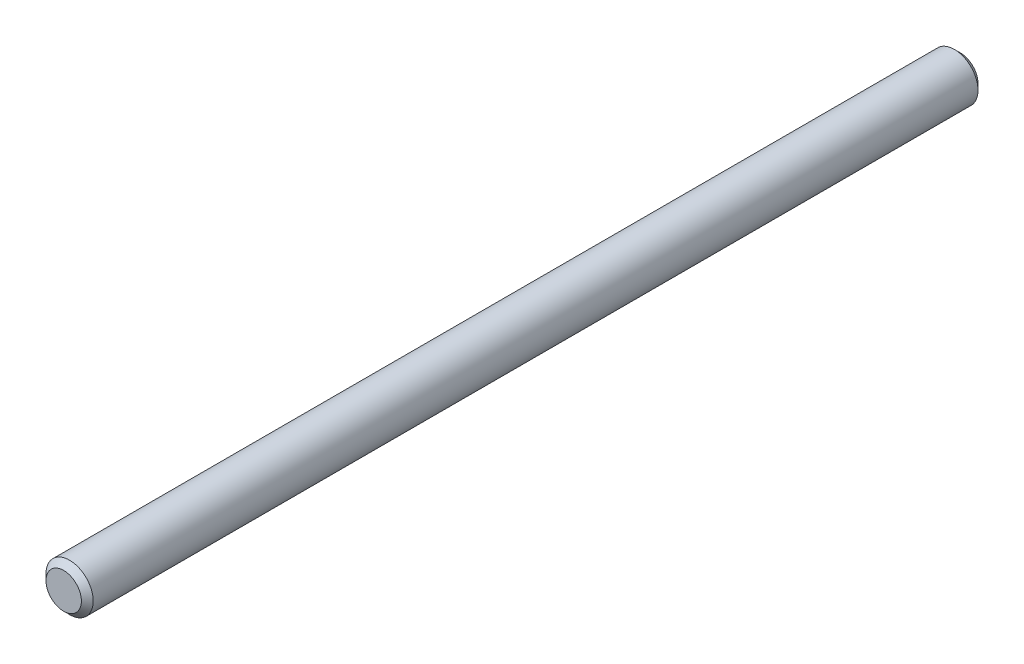
ISO-10303-21;
HEADER;
FILE_DESCRIPTION(('STEP AP214'),'2;1');
FILE_NAME('part.step','',(''),(''),'','','');
FILE_SCHEMA(('AUTOMOTIVE_DESIGN { 1 0 10303 214 1 1 1 1 }'));
ENDSEC;
DATA;
#1=APPLICATION_CONTEXT('core data for automotive mechanical design processes');
#2=APPLICATION_PROTOCOL_DEFINITION('international standard','automotive_design',2000,#1);
#3=PRODUCT_CONTEXT('',#1,'mechanical');
#4=PRODUCT('Part','Part','',(#3));
#5=PRODUCT_RELATED_PRODUCT_CATEGORY('part','',(#4));
#6=PRODUCT_DEFINITION_FORMATION('','',#4);
#7=PRODUCT_DEFINITION_CONTEXT('part definition',#1,'design');
#8=PRODUCT_DEFINITION('design','',#6,#7);
#9=PRODUCT_DEFINITION_SHAPE('','',#8);
#10=(LENGTH_UNIT() NAMED_UNIT(*) SI_UNIT(.MILLI.,.METRE.));
#11=(NAMED_UNIT(*) PLANE_ANGLE_UNIT() SI_UNIT($,.RADIAN.));
#12=(NAMED_UNIT(*) SI_UNIT($,.STERADIAN.) SOLID_ANGLE_UNIT());
#13=UNCERTAINTY_MEASURE_WITH_UNIT(LENGTH_MEASURE(1.E-05),#10,'distance_accuracy_value','');
#14=(GEOMETRIC_REPRESENTATION_CONTEXT(3) GLOBAL_UNCERTAINTY_ASSIGNED_CONTEXT((#13)) GLOBAL_UNIT_ASSIGNED_CONTEXT((#10,
#11,#12)) REPRESENTATION_CONTEXT('',''));
#15=CARTESIAN_POINT('',(0.,0.,0.));
#16=DIRECTION('',(0.,0.,1.));
#17=DIRECTION('',(1.,0.,0.));
#18=AXIS2_PLACEMENT_3D('',#15,#16,#17);
#19=CARTESIAN_POINT('',(0.,0.,114.));
#20=DIRECTION('',(0.,0.,-1.));
#21=DIRECTION('',(-1.,0.,0.));
#22=AXIS2_PLACEMENT_3D('',#19,#20,#21);
#23=CYLINDRICAL_SURFACE('',#22,3.);
#24=CARTESIAN_POINT('',(0.,0.,113.25));
#25=DIRECTION('',(0.,0.,1.));
#26=DIRECTION('',(1.,0.,0.));
#27=AXIS2_PLACEMENT_3D('',#24,#25,#26);
#28=CIRCLE('',#27,3.);
#29=CARTESIAN_POINT('',(-3.,0.,113.25));
#30=VERTEX_POINT('',#29);
#31=EDGE_CURVE('E10',#30,#30,#28,.F.);
#32=CARTESIAN_POINT('',(0.,0.,0.750000000000112));
#33=DIRECTION('',(0.,0.,1.));
#34=DIRECTION('',(1.,0.,0.));
#35=AXIS2_PLACEMENT_3D('',#32,#33,#34);
#36=CIRCLE('',#35,3.);
#37=CARTESIAN_POINT('',(-3.,0.,0.750000000000112));
#38=VERTEX_POINT('',#37);
#39=EDGE_CURVE('E46',#38,#38,#36,.T.);
#40=CARTESIAN_POINT('',(-3.,0.,113.25));
#41=CARTESIAN_POINT('',(-3.,0.,112.078125));
#42=CARTESIAN_POINT('',(-3.,0.,110.90625));
#43=CARTESIAN_POINT('',(-3.,0.,108.5625));
#44=CARTESIAN_POINT('',(-3.,0.,107.390625));
#45=CARTESIAN_POINT('',(-3.,0.,105.046875));
#46=CARTESIAN_POINT('',(-3.,0.,103.875));
#47=CARTESIAN_POINT('',(-3.,0.,101.53125));
#48=CARTESIAN_POINT('',(-3.,0.,100.359375));
#49=CARTESIAN_POINT('',(-3.,0.,98.0156250000001));
#50=CARTESIAN_POINT('',(-3.,0.,96.8437500000001));
#51=CARTESIAN_POINT('',(-3.,0.,94.5000000000001));
#52=CARTESIAN_POINT('',(-3.,0.,93.3281250000001));
#53=CARTESIAN_POINT('',(-3.,0.,90.9843750000001));
#54=CARTESIAN_POINT('',(-3.,0.,89.8125000000001));
#55=CARTESIAN_POINT('',(-3.,0.,87.4687500000001));
#56=CARTESIAN_POINT('',(-3.,0.,86.2968750000001));
#57=CARTESIAN_POINT('',(-3.,0.,83.9531250000001));
#58=CARTESIAN_POINT('',(-3.,0.,82.7812500000001));
#59=CARTESIAN_POINT('',(-3.,0.,80.4375000000001));
#60=CARTESIAN_POINT('',(-3.,0.,79.2656250000001));
#61=CARTESIAN_POINT('',(-3.,0.,76.9218750000001));
#62=CARTESIAN_POINT('',(-3.,0.,75.7500000000001));
#63=CARTESIAN_POINT('',(-3.,0.,73.4062500000001));
#64=CARTESIAN_POINT('',(-3.,0.,72.2343750000001));
#65=CARTESIAN_POINT('',(-3.,0.,69.8906250000001));
#66=CARTESIAN_POINT('',(-3.,0.,68.7187500000001));
#67=CARTESIAN_POINT('',(-3.,0.,66.3750000000001));
#68=CARTESIAN_POINT('',(-3.,0.,65.2031250000001));
#69=CARTESIAN_POINT('',(-3.,0.,62.8593750000001));
#70=CARTESIAN_POINT('',(-3.,0.,61.6875000000001));
#71=CARTESIAN_POINT('',(-3.,0.,59.3437500000001));
#72=CARTESIAN_POINT('',(-3.,0.,58.1718750000001));
#73=CARTESIAN_POINT('',(-3.,0.,55.8281250000001));
#74=CARTESIAN_POINT('',(-3.,0.,54.6562500000001));
#75=CARTESIAN_POINT('',(-3.,0.,52.3125000000001));
#76=CARTESIAN_POINT('',(-3.,0.,51.1406250000001));
#77=CARTESIAN_POINT('',(-3.,0.,48.7968750000001));
#78=CARTESIAN_POINT('',(-3.,0.,47.6250000000001));
#79=CARTESIAN_POINT('',(-3.,0.,45.2812500000001));
#80=CARTESIAN_POINT('',(-3.,0.,44.1093750000001));
#81=CARTESIAN_POINT('',(-3.,0.,41.7656250000001));
#82=CARTESIAN_POINT('',(-3.,0.,40.5937500000001));
#83=CARTESIAN_POINT('',(-3.,0.,38.2500000000001));
#84=CARTESIAN_POINT('',(-3.,0.,37.0781250000001));
#85=CARTESIAN_POINT('',(-3.,0.,34.7343750000001));
#86=CARTESIAN_POINT('',(-3.,0.,33.5625000000001));
#87=CARTESIAN_POINT('',(-3.,0.,31.2187500000001));
#88=CARTESIAN_POINT('',(-3.,0.,30.0468750000001));
#89=CARTESIAN_POINT('',(-3.,0.,27.7031250000001));
#90=CARTESIAN_POINT('',(-3.,0.,26.5312500000001));
#91=CARTESIAN_POINT('',(-3.,0.,24.1875000000001));
#92=CARTESIAN_POINT('',(-3.,0.,23.0156250000001));
#93=CARTESIAN_POINT('',(-3.,0.,20.6718750000001));
#94=CARTESIAN_POINT('',(-3.,0.,19.5000000000001));
#95=CARTESIAN_POINT('',(-3.,0.,17.1562500000001));
#96=CARTESIAN_POINT('',(-3.,0.,15.9843750000001));
#97=CARTESIAN_POINT('',(-3.,0.,13.6406250000001));
#98=CARTESIAN_POINT('',(-3.,0.,12.4687500000001));
#99=CARTESIAN_POINT('',(-3.,0.,10.1250000000001));
#100=CARTESIAN_POINT('',(-3.,0.,8.9531250000001));
#101=CARTESIAN_POINT('',(-3.,0.,6.6093750000001));
#102=CARTESIAN_POINT('',(-3.,0.,5.4375000000001));
#103=CARTESIAN_POINT('',(-3.,0.,3.09375000000011));
#104=CARTESIAN_POINT('',(-3.,0.,1.92187500000011));
#105=CARTESIAN_POINT('',(-3.,0.,0.750000000000112));
#106=B_SPLINE_CURVE_WITH_KNOTS('',3,(#40,#41,#42,#43,#44,#45,#46,#47,#48,#49,#50,#51,#52,#53,
#54,#55,#56,#57,#58,#59,#60,#61,#62,#63,#64,#65,#66,#67,#68,#69,#70,#71,#72,#73,#74,#75,#76,#77,
#78,#79,#80,#81,#82,#83,#84,#85,#86,#87,#88,#89,#90,#91,#92,#93,#94,#95,#96,#97,#98,#99,#100,
#101,#102,#103,#104,#105),.UNSPECIFIED.,.F.,.F.,(4,2,2,2,2,2,2,2,2,2,2,2,2,2,2,2,2,2,2,2,2,2,2,
2,2,2,2,2,2,2,2,2,4),(0.,3.51562500000001,7.03125,10.546875,14.0625,17.578125,21.09375,
24.609375,28.125,31.640625,35.15625,38.671875,42.1875,45.703125,49.21875,52.734375,56.25,
59.765625,63.28125,66.796875,70.3125,73.828125,77.34375,80.859375,84.375,87.890625,91.40625,
94.9218749999999,98.4375,101.953125,105.46875,108.984375,112.5),.UNSPECIFIED.);
#107=EDGE_CURVE('BSEAM31',#30,#38,#106,.T.);
#108=ORIENTED_EDGE('',*,*,#31,.T.);
#109=ORIENTED_EDGE('',*,*,#39,.T.);
#110=ORIENTED_EDGE('',*,*,#107,.T.);
#111=ORIENTED_EDGE('',*,*,#107,.F.);
#112=EDGE_LOOP('',(#108,#110,#109,#111));
#113=FACE_BOUND('',#112,.T.);
#114=ADVANCED_FACE('F31',(#113),#23,.T.);
#115=CARTESIAN_POINT('',(0.,0.,114.));
#116=DIRECTION('',(0.,0.,1.));
#117=DIRECTION('',(1.,0.,0.));
#118=AXIS2_PLACEMENT_3D('',#115,#116,#117);
#119=PLANE('',#118);
#120=CARTESIAN_POINT('',(0.,0.,114.));
#121=DIRECTION('',(0.,0.,1.));
#122=DIRECTION('',(1.,0.,0.));
#123=AXIS2_PLACEMENT_3D('',#120,#121,#122);
#124=CIRCLE('',#123,2.25000000000007);
#125=CARTESIAN_POINT('',(2.25000000000007,0.,114.));
#126=VERTEX_POINT('',#125);
#127=EDGE_CURVE('E38',#126,#126,#124,.T.);
#128=ORIENTED_EDGE('',*,*,#127,.T.);
#129=EDGE_LOOP('',(#128));
#130=FACE_BOUND('',#129,.T.);
#131=ADVANCED_FACE('F62',(#130),#119,.T.);
#132=CARTESIAN_POINT('',(0.,0.,0.));
#133=DIRECTION('',(0.,0.,1.));
#134=DIRECTION('',(1.,0.,0.));
#135=AXIS2_PLACEMENT_3D('',#132,#133,#134);
#136=PLANE('',#135);
#137=CARTESIAN_POINT('',(0.,0.,0.));
#138=DIRECTION('',(0.,0.,1.));
#139=DIRECTION('',(1.,0.,0.));
#140=AXIS2_PLACEMENT_3D('',#137,#138,#139);
#141=CIRCLE('',#140,2.24999999999989);
#142=CARTESIAN_POINT('',(2.24999999999989,0.,0.));
#143=VERTEX_POINT('',#142);
#144=EDGE_CURVE('E42',#143,#143,#141,.F.);
#145=ORIENTED_EDGE('',*,*,#144,.T.);
#146=EDGE_LOOP('',(#145));
#147=FACE_BOUND('',#146,.T.);
#148=ADVANCED_FACE('F55',(#147),#136,.F.);
#149=CARTESIAN_POINT('',(0.,0.,0.750000000000112));
#150=DIRECTION('',(0.,0.,1.));
#151=DIRECTION('',(1.,0.,0.));
#152=AXIS2_PLACEMENT_3D('',#149,#150,#151);
#153=CONICAL_SURFACE('',#152,3.,0.785398163397447);
#154=ORIENTED_EDGE('',*,*,#144,.F.);
#155=EDGE_LOOP('',(#154));
#156=FACE_BOUND('',#155,.T.);
#157=ORIENTED_EDGE('',*,*,#39,.F.);
#158=EDGE_LOOP('',(#157));
#159=FACE_BOUND('',#158,.T.);
#160=ADVANCED_FACE('F53',(#156,#159),#153,.T.);
#161=CARTESIAN_POINT('',(0.,0.,114.));
#162=DIRECTION('',(0.,0.,-1.));
#163=DIRECTION('',(-1.,0.,0.));
#164=AXIS2_PLACEMENT_3D('',#161,#162,#163);
#165=CONICAL_SURFACE('',#164,2.25000000000007,0.785398163397438);
#166=ORIENTED_EDGE('',*,*,#31,.F.);
#167=EDGE_LOOP('',(#166));
#168=FACE_BOUND('',#167,.T.);
#169=ORIENTED_EDGE('',*,*,#127,.F.);
#170=EDGE_LOOP('',(#169));
#171=FACE_BOUND('',#170,.T.);
#172=ADVANCED_FACE('F33',(#168,#171),#165,.T.);
#173=CLOSED_SHELL('',(#114,#131,#148,#160,#172));
#174=MANIFOLD_SOLID_BREP('B2',#173);
#175=ADVANCED_BREP_SHAPE_REPRESENTATION('',(#18,#174),#14);
#176=SHAPE_DEFINITION_REPRESENTATION(#9,#175);
ENDSEC;
END-ISO-10303-21;
